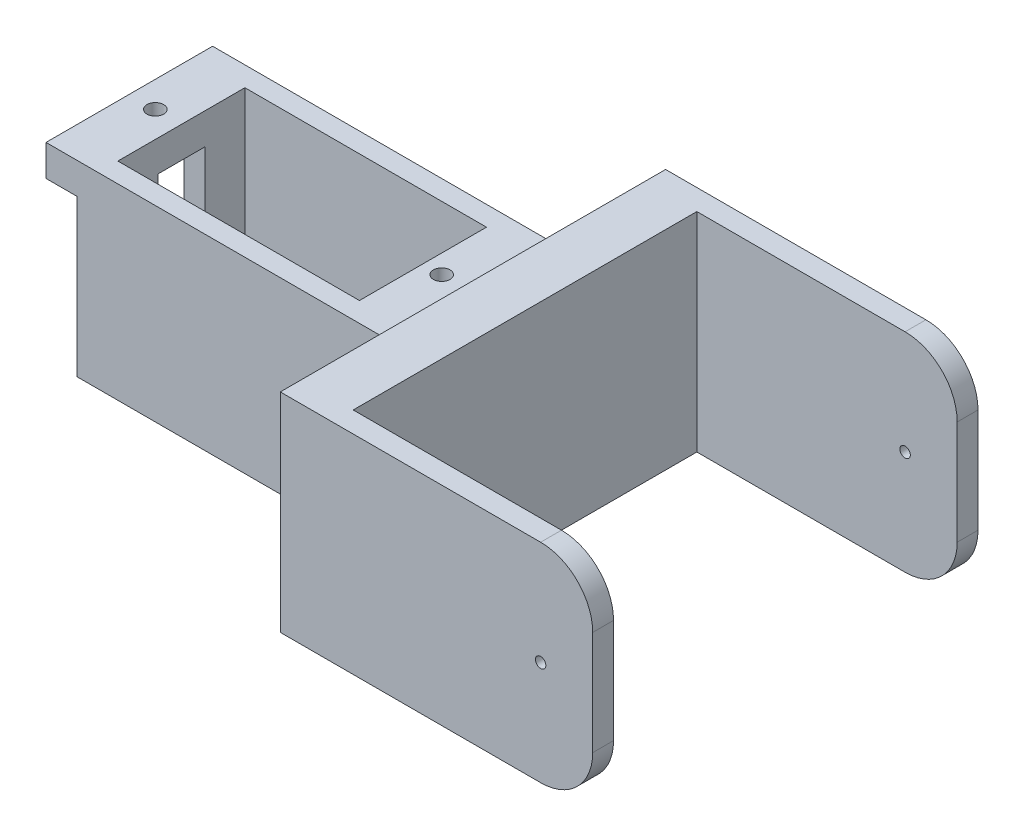
ISO-10303-21;
HEADER;
FILE_DESCRIPTION(('STEP AP214'),'2;1');
FILE_NAME('part.step','',(''),(''),'','','');
FILE_SCHEMA(('AUTOMOTIVE_DESIGN { 1 0 10303 214 1 1 1 1 }'));
ENDSEC;
DATA;
#1=APPLICATION_CONTEXT('core data for automotive mechanical design processes');
#2=APPLICATION_PROTOCOL_DEFINITION('international standard','automotive_design',2000,#1);
#3=PRODUCT_CONTEXT('',#1,'mechanical');
#4=PRODUCT('Part','Part','',(#3));
#5=PRODUCT_RELATED_PRODUCT_CATEGORY('part','',(#4));
#6=PRODUCT_DEFINITION_FORMATION('','',#4);
#7=PRODUCT_DEFINITION_CONTEXT('part definition',#1,'design');
#8=PRODUCT_DEFINITION('design','',#6,#7);
#9=PRODUCT_DEFINITION_SHAPE('','',#8);
#10=(LENGTH_UNIT() NAMED_UNIT(*) SI_UNIT(.MILLI.,.METRE.));
#11=(NAMED_UNIT(*) PLANE_ANGLE_UNIT() SI_UNIT($,.RADIAN.));
#12=(NAMED_UNIT(*) SI_UNIT($,.STERADIAN.) SOLID_ANGLE_UNIT());
#13=UNCERTAINTY_MEASURE_WITH_UNIT(LENGTH_MEASURE(1.E-05),#10,'distance_accuracy_value','');
#14=(GEOMETRIC_REPRESENTATION_CONTEXT(3) GLOBAL_UNCERTAINTY_ASSIGNED_CONTEXT((#13)) GLOBAL_UNIT_ASSIGNED_CONTEXT((#10,
#11,#12)) REPRESENTATION_CONTEXT('',''));
#15=CARTESIAN_POINT('',(0.,0.,0.));
#16=DIRECTION('',(0.,0.,1.));
#17=DIRECTION('',(1.,0.,0.));
#18=AXIS2_PLACEMENT_3D('',#15,#16,#17);
#19=CARTESIAN_POINT('',(20.,0.,0.));
#20=DIRECTION('',(1.,0.,0.));
#21=DIRECTION('',(0.,0.,-1.));
#22=AXIS2_PLACEMENT_3D('',#19,#20,#21);
#23=PLANE('',#22);
#24=DIRECTION('',(0.,0.,1.));
#25=VECTOR('',#24,1.);
#26=CARTESIAN_POINT('',(20.,19.,-18.5));
#27=LINE('',#26,#25);
#28=CARTESIAN_POINT('',(20.,19.,-16.5));
#29=VERTEX_POINT('',#28);
#30=CARTESIAN_POINT('',(20.,19.,16.5));
#31=VERTEX_POINT('',#30);
#32=EDGE_CURVE('E218',#29,#31,#27,.T.);
#33=ORIENTED_EDGE('',*,*,#32,.T.);
#34=DIRECTION('',(0.,1.,0.));
#35=VECTOR('',#34,1.);
#36=CARTESIAN_POINT('',(20.,19.,16.5));
#37=LINE('',#36,#35);
#38=CARTESIAN_POINT('',(20.,-1.,16.5));
#39=VERTEX_POINT('',#38);
#40=EDGE_CURVE('E227',#39,#31,#37,.T.);
#41=ORIENTED_EDGE('',*,*,#40,.F.);
#42=DIRECTION('',(0.,0.,-1.));
#43=VECTOR('',#42,1.);
#44=CARTESIAN_POINT('',(20.,-0.999999999999999,-18.5));
#45=LINE('',#44,#43);
#46=CARTESIAN_POINT('',(20.,-1.,-16.5));
#47=VERTEX_POINT('',#46);
#48=EDGE_CURVE('E240',#39,#47,#45,.T.);
#49=ORIENTED_EDGE('',*,*,#48,.T.);
#50=DIRECTION('',(0.,-1.,0.));
#51=VECTOR('',#50,1.);
#52=CARTESIAN_POINT('',(20.,19.,-16.5));
#53=LINE('',#52,#51);
#54=EDGE_CURVE('E238',#29,#47,#53,.T.);
#55=ORIENTED_EDGE('',*,*,#54,.F.);
#56=EDGE_LOOP('',(#33,#41,#49,#55));
#57=FACE_BOUND('',#56,.T.);
#58=ADVANCED_FACE('F36',(#57),#23,.T.);
#59=CARTESIAN_POINT('',(-15.,2.,8.));
#60=DIRECTION('',(1.,0.,0.));
#61=DIRECTION('',(0.,0.,-1.));
#62=AXIS2_PLACEMENT_3D('',#59,#60,#61);
#63=PLANE('',#62);
#64=DIRECTION('',(0.,-1.,0.));
#65=VECTOR('',#64,1.);
#66=CARTESIAN_POINT('',(-15.,2.,8.));
#67=LINE('',#66,#65);
#68=CARTESIAN_POINT('',(-15.,15.,8.));
#69=VERTEX_POINT('',#68);
#70=CARTESIAN_POINT('',(-15.,0.,8.));
#71=VERTEX_POINT('',#70);
#72=EDGE_CURVE('E381',#69,#71,#67,.T.);
#73=ORIENTED_EDGE('',*,*,#72,.F.);
#74=DIRECTION('',(0.,0.,-1.));
#75=VECTOR('',#74,1.);
#76=CARTESIAN_POINT('',(-15.,15.,8.));
#77=LINE('',#76,#75);
#78=CARTESIAN_POINT('',(-15.,15.,2.25));
#79=VERTEX_POINT('',#78);
#80=EDGE_CURVE('E299',#69,#79,#77,.T.);
#81=ORIENTED_EDGE('',*,*,#80,.T.);
#82=DIRECTION('',(0.,1.,0.));
#83=VECTOR('',#82,1.);
#84=CARTESIAN_POINT('',(-15.,18.,2.25));
#85=LINE('',#84,#83);
#86=CARTESIAN_POINT('',(-15.,5.,2.25));
#87=VERTEX_POINT('',#86);
#88=EDGE_CURVE('E309',#87,#79,#85,.T.);
#89=ORIENTED_EDGE('',*,*,#88,.F.);
#90=DIRECTION('',(0.,0.,1.));
#91=VECTOR('',#90,1.);
#92=CARTESIAN_POINT('',(-15.,5.,-2.25));
#93=LINE('',#92,#91);
#94=CARTESIAN_POINT('',(-15.,5.,-2.25));
#95=VERTEX_POINT('',#94);
#96=EDGE_CURVE('E323',#95,#87,#93,.T.);
#97=ORIENTED_EDGE('',*,*,#96,.F.);
#98=DIRECTION('',(0.,-1.,0.));
#99=VECTOR('',#98,1.);
#100=CARTESIAN_POINT('',(-15.,18.,-2.25));
#101=LINE('',#100,#99);
#102=CARTESIAN_POINT('',(-15.,15.,-2.25));
#103=VERTEX_POINT('',#102);
#104=EDGE_CURVE('E304',#103,#95,#101,.T.);
#105=ORIENTED_EDGE('',*,*,#104,.F.);
#106=CARTESIAN_POINT('',(-15.,15.,-8.));
#107=VERTEX_POINT('',#106);
#108=EDGE_CURVE('E293',#103,#107,#77,.T.);
#109=ORIENTED_EDGE('',*,*,#108,.T.);
#110=DIRECTION('',(0.,-1.,0.));
#111=VECTOR('',#110,1.);
#112=CARTESIAN_POINT('',(-15.,2.,-8.));
#113=LINE('',#112,#111);
#114=CARTESIAN_POINT('',(-15.,0.,-8.));
#115=VERTEX_POINT('',#114);
#116=EDGE_CURVE('E374',#107,#115,#113,.T.);
#117=ORIENTED_EDGE('',*,*,#116,.T.);
#118=DIRECTION('',(0.,0.,1.));
#119=VECTOR('',#118,1.);
#120=CARTESIAN_POINT('',(-15.,0.,8.));
#121=LINE('',#120,#119);
#122=EDGE_CURVE('E362',#115,#71,#121,.T.);
#123=ORIENTED_EDGE('',*,*,#122,.T.);
#124=EDGE_LOOP('',(#73,#81,#89,#97,#105,#109,#117,#123));
#125=FACE_BOUND('',#124,.T.);
#126=ADVANCED_FACE('F465',(#125),#63,.F.);
#127=CARTESIAN_POINT('',(15.,2.,8.));
#128=DIRECTION('',(0.,0.,-1.));
#129=DIRECTION('',(-1.,0.,0.));
#130=AXIS2_PLACEMENT_3D('',#127,#128,#129);
#131=PLANE('',#130);
#132=DIRECTION('',(0.,-1.,0.));
#133=VECTOR('',#132,1.);
#134=CARTESIAN_POINT('',(15.,2.,8.));
#135=LINE('',#134,#133);
#136=CARTESIAN_POINT('',(15.,18.,8.));
#137=VERTEX_POINT('',#136);
#138=CARTESIAN_POINT('',(15.,0.,8.));
#139=VERTEX_POINT('',#138);
#140=EDGE_CURVE('E378',#137,#139,#135,.T.);
#141=ORIENTED_EDGE('',*,*,#140,.F.);
#142=DIRECTION('',(1.,0.,0.));
#143=VECTOR('',#142,1.);
#144=CARTESIAN_POINT('',(-15.,18.,8.));
#145=LINE('',#144,#143);
#146=CARTESIAN_POINT('',(-18.,18.,8.));
#147=VERTEX_POINT('',#146);
#148=EDGE_CURVE('E356',#147,#137,#145,.T.);
#149=ORIENTED_EDGE('',*,*,#148,.F.);
#150=DIRECTION('',(0.,1.,0.));
#151=VECTOR('',#150,1.);
#152=CARTESIAN_POINT('',(-18.,15.,8.));
#153=LINE('',#152,#151);
#154=CARTESIAN_POINT('',(-18.,15.,8.));
#155=VERTEX_POINT('',#154);
#156=EDGE_CURVE('E290',#155,#147,#153,.T.);
#157=ORIENTED_EDGE('',*,*,#156,.F.);
#158=DIRECTION('',(1.,0.,0.));
#159=VECTOR('',#158,1.);
#160=CARTESIAN_POINT('',(-13.,15.,8.));
#161=LINE('',#160,#159);
#162=EDGE_CURVE('E284',#155,#69,#161,.T.);
#163=ORIENTED_EDGE('',*,*,#162,.T.);
#164=ORIENTED_EDGE('',*,*,#72,.T.);
#165=DIRECTION('',(1.,0.,0.));
#166=VECTOR('',#165,1.);
#167=CARTESIAN_POINT('',(15.,0.,8.));
#168=LINE('',#167,#166);
#169=EDGE_CURVE('E365',#71,#139,#168,.T.);
#170=ORIENTED_EDGE('',*,*,#169,.T.);
#171=EDGE_LOOP('',(#141,#149,#157,#163,#164,#170));
#172=FACE_BOUND('',#171,.T.);
#173=ADVANCED_FACE('F470',(#172),#131,.F.);
#174=CARTESIAN_POINT('',(15.,2.,-8.));
#175=DIRECTION('',(0.,0.,1.));
#176=DIRECTION('',(1.,0.,0.));
#177=AXIS2_PLACEMENT_3D('',#174,#175,#176);
#178=PLANE('',#177);
#179=DIRECTION('',(0.,1.,0.));
#180=VECTOR('',#179,1.);
#181=CARTESIAN_POINT('',(-18.,15.,-8.));
#182=LINE('',#181,#180);
#183=CARTESIAN_POINT('',(-18.,15.,-8.));
#184=VERTEX_POINT('',#183);
#185=CARTESIAN_POINT('',(-18.,18.,-8.));
#186=VERTEX_POINT('',#185);
#187=EDGE_CURVE('E287',#184,#186,#182,.T.);
#188=ORIENTED_EDGE('',*,*,#187,.T.);
#189=DIRECTION('',(-1.,0.,0.));
#190=VECTOR('',#189,1.);
#191=CARTESIAN_POINT('',(10.2,18.,-8.));
#192=LINE('',#191,#190);
#193=CARTESIAN_POINT('',(15.,18.,-8.));
#194=VERTEX_POINT('',#193);
#195=EDGE_CURVE('E360',#194,#186,#192,.T.);
#196=ORIENTED_EDGE('',*,*,#195,.F.);
#197=DIRECTION('',(0.,-1.,0.));
#198=VECTOR('',#197,1.);
#199=CARTESIAN_POINT('',(15.,2.,-8.));
#200=LINE('',#199,#198);
#201=CARTESIAN_POINT('',(15.,0.,-8.));
#202=VERTEX_POINT('',#201);
#203=EDGE_CURVE('E376',#194,#202,#200,.T.);
#204=ORIENTED_EDGE('',*,*,#203,.T.);
#205=DIRECTION('',(-1.,0.,0.));
#206=VECTOR('',#205,1.);
#207=CARTESIAN_POINT('',(15.,0.,-8.));
#208=LINE('',#207,#206);
#209=EDGE_CURVE('E371',#202,#115,#208,.T.);
#210=ORIENTED_EDGE('',*,*,#209,.T.);
#211=ORIENTED_EDGE('',*,*,#116,.F.);
#212=DIRECTION('',(-1.,0.,0.));
#213=VECTOR('',#212,1.);
#214=CARTESIAN_POINT('',(-13.,15.,-8.));
#215=LINE('',#214,#213);
#216=EDGE_CURVE('E279',#107,#184,#215,.T.);
#217=ORIENTED_EDGE('',*,*,#216,.T.);
#218=EDGE_LOOP('',(#188,#196,#204,#210,#211,#217));
#219=FACE_BOUND('',#218,.T.);
#220=ADVANCED_FACE('F556',(#219),#178,.F.);
#221=CARTESIAN_POINT('',(0.,0.,0.));
#222=DIRECTION('',(0.,1.,0.));
#223=DIRECTION('',(0.,0.,1.));
#224=AXIS2_PLACEMENT_3D('',#221,#222,#223);
#225=PLANE('',#224);
#226=CARTESIAN_POINT('',(-10.,0.,0.));
#227=DIRECTION('',(0.,-1.,0.));
#228=DIRECTION('',(0.,0.,-1.));
#229=AXIS2_PLACEMENT_3D('',#226,#227,#228);
#230=CIRCLE('',#229,0.800000000000001);
#231=CARTESIAN_POINT('',(-10.,0.,-0.800000000000001));
#232=VERTEX_POINT('',#231);
#233=EDGE_CURVE('E305',#232,#232,#230,.T.);
#234=ORIENTED_EDGE('',*,*,#233,.F.);
#235=EDGE_LOOP('',(#234));
#236=FACE_BOUND('',#235,.T.);
#237=ORIENTED_EDGE('',*,*,#122,.F.);
#238=ORIENTED_EDGE('',*,*,#209,.F.);
#239=DIRECTION('',(0.,0.,-1.));
#240=VECTOR('',#239,1.);
#241=CARTESIAN_POINT('',(15.,0.,8.));
#242=LINE('',#241,#240);
#243=EDGE_CURVE('E368',#139,#202,#242,.T.);
#244=ORIENTED_EDGE('',*,*,#243,.F.);
#245=ORIENTED_EDGE('',*,*,#169,.F.);
#246=EDGE_LOOP('',(#237,#238,#244,#245));
#247=FACE_BOUND('',#246,.T.);
#248=ADVANCED_FACE('F549',(#236,#247),#225,.F.);
#249=CARTESIAN_POINT('',(0.,18.,0.));
#250=DIRECTION('',(0.,1.,0.));
#251=DIRECTION('',(0.,0.,1.));
#252=AXIS2_PLACEMENT_3D('',#249,#250,#251);
#253=PLANE('',#252);
#254=CARTESIAN_POINT('',(-15.5009715513472,18.,0.));
#255=DIRECTION('',(0.,1.,0.));
#256=DIRECTION('',(0.,0.,1.));
#257=AXIS2_PLACEMENT_3D('',#254,#255,#256);
#258=CIRCLE('',#257,0.800000000000001);
#259=CARTESIAN_POINT('',(-15.5009715513472,18.,0.800000000000001));
#260=VERTEX_POINT('',#259);
#261=EDGE_CURVE('E265',#260,#260,#258,.T.);
#262=ORIENTED_EDGE('',*,*,#261,.F.);
#263=EDGE_LOOP('',(#262));
#264=FACE_BOUND('',#263,.T.);
#265=CARTESIAN_POINT('',(12.,18.,0.));
#266=DIRECTION('',(0.,1.,0.));
#267=DIRECTION('',(0.,0.,1.));
#268=AXIS2_PLACEMENT_3D('',#265,#266,#267);
#269=CIRCLE('',#268,0.800000000000001);
#270=CARTESIAN_POINT('',(12.,18.,0.800000000000001));
#271=VERTEX_POINT('',#270);
#272=EDGE_CURVE('E273',#271,#271,#269,.T.);
#273=ORIENTED_EDGE('',*,*,#272,.F.);
#274=EDGE_LOOP('',(#273));
#275=FACE_BOUND('',#274,.T.);
#276=DIRECTION('',(-1.,0.,0.));
#277=VECTOR('',#276,1.);
#278=CARTESIAN_POINT('',(-13.,18.,-6.1));
#279=LINE('',#278,#277);
#280=CARTESIAN_POINT('',(10.2,18.,-6.1));
#281=VERTEX_POINT('',#280);
#282=CARTESIAN_POINT('',(-13.,18.,-6.1));
#283=VERTEX_POINT('',#282);
#284=EDGE_CURVE('E331',#281,#283,#279,.T.);
#285=ORIENTED_EDGE('',*,*,#284,.F.);
#286=DIRECTION('',(0.,0.,-1.));
#287=VECTOR('',#286,1.);
#288=CARTESIAN_POINT('',(10.2,18.,-6.1));
#289=LINE('',#288,#287);
#290=CARTESIAN_POINT('',(10.2,18.,6.1));
#291=VERTEX_POINT('',#290);
#292=EDGE_CURVE('E329',#291,#281,#289,.T.);
#293=ORIENTED_EDGE('',*,*,#292,.F.);
#294=DIRECTION('',(1.,0.,0.));
#295=VECTOR('',#294,1.);
#296=CARTESIAN_POINT('',(-13.,18.,6.1));
#297=LINE('',#296,#295);
#298=CARTESIAN_POINT('',(-13.,18.,6.1));
#299=VERTEX_POINT('',#298);
#300=EDGE_CURVE('E336',#299,#291,#297,.T.);
#301=ORIENTED_EDGE('',*,*,#300,.F.);
#302=DIRECTION('',(0.,0.,1.));
#303=VECTOR('',#302,1.);
#304=CARTESIAN_POINT('',(-13.,18.,-6.1));
#305=LINE('',#304,#303);
#306=EDGE_CURVE('E334',#283,#299,#305,.T.);
#307=ORIENTED_EDGE('',*,*,#306,.F.);
#308=EDGE_LOOP('',(#285,#293,#301,#307));
#309=FACE_BOUND('',#308,.T.);
#310=ORIENTED_EDGE('',*,*,#195,.T.);
#311=DIRECTION('',(0.,0.,1.));
#312=VECTOR('',#311,1.);
#313=CARTESIAN_POINT('',(-18.,18.,-8.));
#314=LINE('',#313,#312);
#315=EDGE_CURVE('E272',#186,#147,#314,.T.);
#316=ORIENTED_EDGE('',*,*,#315,.T.);
#317=ORIENTED_EDGE('',*,*,#148,.T.);
#318=DIRECTION('',(0.,0.,-1.));
#319=VECTOR('',#318,1.);
#320=CARTESIAN_POINT('',(15.,18.,-8.));
#321=LINE('',#320,#319);
#322=EDGE_CURVE('E358',#137,#194,#321,.T.);
#323=ORIENTED_EDGE('',*,*,#322,.T.);
#324=EDGE_LOOP('',(#310,#316,#317,#323));
#325=FACE_BOUND('',#324,.T.);
#326=ADVANCED_FACE('F545',(#264,#275,#309,#325),#253,.T.);
#327=CARTESIAN_POINT('',(10.2,18.,-6.1));
#328=DIRECTION('',(-1.,0.,0.));
#329=DIRECTION('',(0.,0.,1.));
#330=AXIS2_PLACEMENT_3D('',#327,#328,#329);
#331=PLANE('',#330);
#332=DIRECTION('',(0.,-1.,0.));
#333=VECTOR('',#332,1.);
#334=CARTESIAN_POINT('',(10.2,18.,-6.1));
#335=LINE('',#334,#333);
#336=CARTESIAN_POINT('',(10.2,2.,-6.1));
#337=VERTEX_POINT('',#336);
#338=EDGE_CURVE('E354',#281,#337,#335,.T.);
#339=ORIENTED_EDGE('',*,*,#338,.T.);
#340=DIRECTION('',(0.,0.,-1.));
#341=VECTOR('',#340,1.);
#342=CARTESIAN_POINT('',(10.2,2.,-6.1));
#343=LINE('',#342,#341);
#344=CARTESIAN_POINT('',(10.2,2.,6.1));
#345=VERTEX_POINT('',#344);
#346=EDGE_CURVE('E328',#345,#337,#343,.T.);
#347=ORIENTED_EDGE('',*,*,#346,.F.);
#348=DIRECTION('',(0.,-1.,0.));
#349=VECTOR('',#348,1.);
#350=CARTESIAN_POINT('',(10.2,18.,6.1));
#351=LINE('',#350,#349);
#352=EDGE_CURVE('E338',#291,#345,#351,.T.);
#353=ORIENTED_EDGE('',*,*,#352,.F.);
#354=ORIENTED_EDGE('',*,*,#292,.T.);
#355=EDGE_LOOP('',(#339,#347,#353,#354));
#356=FACE_BOUND('',#355,.T.);
#357=ADVANCED_FACE('F541',(#356),#331,.T.);
#358=CARTESIAN_POINT('',(-13.,18.,-6.1));
#359=DIRECTION('',(0.,0.,1.));
#360=DIRECTION('',(1.,0.,0.));
#361=AXIS2_PLACEMENT_3D('',#358,#359,#360);
#362=PLANE('',#361);
#363=DIRECTION('',(-1.,0.,0.));
#364=VECTOR('',#363,1.);
#365=CARTESIAN_POINT('',(-13.,2.,-6.1));
#366=LINE('',#365,#364);
#367=CARTESIAN_POINT('',(-13.,2.,-6.1));
#368=VERTEX_POINT('',#367);
#369=EDGE_CURVE('E341',#337,#368,#366,.T.);
#370=ORIENTED_EDGE('',*,*,#369,.F.);
#371=ORIENTED_EDGE('',*,*,#338,.F.);
#372=ORIENTED_EDGE('',*,*,#284,.T.);
#373=DIRECTION('',(0.,-1.,0.));
#374=VECTOR('',#373,1.);
#375=CARTESIAN_POINT('',(-13.,18.,-6.1));
#376=LINE('',#375,#374);
#377=EDGE_CURVE('E352',#283,#368,#376,.T.);
#378=ORIENTED_EDGE('',*,*,#377,.T.);
#379=EDGE_LOOP('',(#370,#371,#372,#378));
#380=FACE_BOUND('',#379,.T.);
#381=ADVANCED_FACE('F537',(#380),#362,.T.);
#382=CARTESIAN_POINT('',(-13.,18.,-6.1));
#383=DIRECTION('',(1.,0.,0.));
#384=DIRECTION('',(0.,0.,-1.));
#385=AXIS2_PLACEMENT_3D('',#382,#383,#384);
#386=PLANE('',#385);
#387=DIRECTION('',(0.,-1.,0.));
#388=VECTOR('',#387,1.);
#389=CARTESIAN_POINT('',(-13.,18.,2.25));
#390=LINE('',#389,#388);
#391=CARTESIAN_POINT('',(-13.,15.,2.25));
#392=VERTEX_POINT('',#391);
#393=CARTESIAN_POINT('',(-13.,5.,2.25));
#394=VERTEX_POINT('',#393);
#395=EDGE_CURVE('E312',#392,#394,#390,.T.);
#396=ORIENTED_EDGE('',*,*,#395,.F.);
#397=DIRECTION('',(0.,0.,-1.));
#398=VECTOR('',#397,1.);
#399=CARTESIAN_POINT('',(-13.,15.,-8.));
#400=LINE('',#399,#398);
#401=CARTESIAN_POINT('',(-13.,15.,-2.25));
#402=VERTEX_POINT('',#401);
#403=EDGE_CURVE('E276',#392,#402,#400,.T.);
#404=ORIENTED_EDGE('',*,*,#403,.T.);
#405=DIRECTION('',(0.,1.,0.));
#406=VECTOR('',#405,1.);
#407=CARTESIAN_POINT('',(-13.,18.,-2.25));
#408=LINE('',#407,#406);
#409=CARTESIAN_POINT('',(-13.,5.,-2.25));
#410=VERTEX_POINT('',#409);
#411=EDGE_CURVE('E317',#410,#402,#408,.T.);
#412=ORIENTED_EDGE('',*,*,#411,.F.);
#413=DIRECTION('',(0.,0.,-1.));
#414=VECTOR('',#413,1.);
#415=CARTESIAN_POINT('',(-13.,5.,-2.25));
#416=LINE('',#415,#414);
#417=EDGE_CURVE('E314',#394,#410,#416,.T.);
#418=ORIENTED_EDGE('',*,*,#417,.F.);
#419=EDGE_LOOP('',(#396,#404,#412,#418));
#420=FACE_BOUND('',#419,.T.);
#421=DIRECTION('',(0.,-1.,0.));
#422=VECTOR('',#421,1.);
#423=CARTESIAN_POINT('',(-13.,18.,6.1));
#424=LINE('',#423,#422);
#425=CARTESIAN_POINT('',(-13.,2.,6.1));
#426=VERTEX_POINT('',#425);
#427=EDGE_CURVE('E350',#299,#426,#424,.T.);
#428=ORIENTED_EDGE('',*,*,#427,.T.);
#429=DIRECTION('',(0.,0.,1.));
#430=VECTOR('',#429,1.);
#431=CARTESIAN_POINT('',(-13.,2.,-6.1));
#432=LINE('',#431,#430);
#433=EDGE_CURVE('E344',#368,#426,#432,.T.);
#434=ORIENTED_EDGE('',*,*,#433,.F.);
#435=ORIENTED_EDGE('',*,*,#377,.F.);
#436=ORIENTED_EDGE('',*,*,#306,.T.);
#437=EDGE_LOOP('',(#428,#434,#435,#436));
#438=FACE_BOUND('',#437,.T.);
#439=ADVANCED_FACE('F533',(#420,#438),#386,.T.);
#440=CARTESIAN_POINT('',(-13.,18.,6.1));
#441=DIRECTION('',(0.,0.,-1.));
#442=DIRECTION('',(-1.,0.,0.));
#443=AXIS2_PLACEMENT_3D('',#440,#441,#442);
#444=PLANE('',#443);
#445=DIRECTION('',(1.,0.,0.));
#446=VECTOR('',#445,1.);
#447=CARTESIAN_POINT('',(-13.,2.,6.1));
#448=LINE('',#447,#446);
#449=EDGE_CURVE('E332',#426,#345,#448,.T.);
#450=ORIENTED_EDGE('',*,*,#449,.F.);
#451=ORIENTED_EDGE('',*,*,#427,.F.);
#452=ORIENTED_EDGE('',*,*,#300,.T.);
#453=ORIENTED_EDGE('',*,*,#352,.T.);
#454=EDGE_LOOP('',(#450,#451,#452,#453));
#455=FACE_BOUND('',#454,.T.);
#456=ADVANCED_FACE('F530',(#455),#444,.T.);
#457=CARTESIAN_POINT('',(0.,2.,0.));
#458=DIRECTION('',(0.,1.,0.));
#459=DIRECTION('',(0.,0.,1.));
#460=AXIS2_PLACEMENT_3D('',#457,#458,#459);
#461=PLANE('',#460);
#462=CARTESIAN_POINT('',(-10.,2.,0.));
#463=DIRECTION('',(0.,-1.,0.));
#464=DIRECTION('',(0.,0.,-1.));
#465=AXIS2_PLACEMENT_3D('',#462,#463,#464);
#466=CIRCLE('',#465,0.800000000000001);
#467=CARTESIAN_POINT('',(-10.,2.,-0.800000000000001));
#468=VERTEX_POINT('',#467);
#469=EDGE_CURVE('E301',#468,#468,#466,.T.);
#470=ORIENTED_EDGE('',*,*,#469,.T.);
#471=EDGE_LOOP('',(#470));
#472=FACE_BOUND('',#471,.T.);
#473=ORIENTED_EDGE('',*,*,#346,.T.);
#474=ORIENTED_EDGE('',*,*,#369,.T.);
#475=ORIENTED_EDGE('',*,*,#433,.T.);
#476=ORIENTED_EDGE('',*,*,#449,.T.);
#477=EDGE_LOOP('',(#473,#474,#475,#476));
#478=FACE_BOUND('',#477,.T.);
#479=ADVANCED_FACE('F528',(#472,#478),#461,.T.);
#480=CARTESIAN_POINT('',(-15.001,18.,2.25));
#481=DIRECTION('',(0.,0.,1.));
#482=DIRECTION('',(0.,-1.,0.));
#483=AXIS2_PLACEMENT_3D('',#480,#481,#482);
#484=PLANE('',#483);
#485=ORIENTED_EDGE('',*,*,#88,.T.);
#486=DIRECTION('',(1.,0.,0.));
#487=VECTOR('',#486,1.);
#488=CARTESIAN_POINT('',(-15.001,15.,2.25));
#489=LINE('',#488,#487);
#490=EDGE_CURVE('E298',#79,#392,#489,.T.);
#491=ORIENTED_EDGE('',*,*,#490,.T.);
#492=ORIENTED_EDGE('',*,*,#395,.T.);
#493=DIRECTION('',(1.,0.,0.));
#494=VECTOR('',#493,1.);
#495=CARTESIAN_POINT('',(-15.001,5.,2.25));
#496=LINE('',#495,#494);
#497=EDGE_CURVE('E320',#87,#394,#496,.T.);
#498=ORIENTED_EDGE('',*,*,#497,.F.);
#499=EDGE_LOOP('',(#485,#491,#492,#498));
#500=FACE_BOUND('',#499,.T.);
#501=ADVANCED_FACE('F521',(#500),#484,.F.);
#502=CARTESIAN_POINT('',(-15.001,18.,-2.25));
#503=DIRECTION('',(0.,0.,-1.));
#504=DIRECTION('',(0.,1.,0.));
#505=AXIS2_PLACEMENT_3D('',#502,#503,#504);
#506=PLANE('',#505);
#507=ORIENTED_EDGE('',*,*,#411,.T.);
#508=DIRECTION('',(-1.,0.,0.));
#509=VECTOR('',#508,1.);
#510=CARTESIAN_POINT('',(-15.001,15.,-2.25));
#511=LINE('',#510,#509);
#512=EDGE_CURVE('E383',#402,#103,#511,.T.);
#513=ORIENTED_EDGE('',*,*,#512,.T.);
#514=ORIENTED_EDGE('',*,*,#104,.T.);
#515=DIRECTION('',(1.,0.,0.));
#516=VECTOR('',#515,1.);
#517=CARTESIAN_POINT('',(-15.001,5.,-2.25));
#518=LINE('',#517,#516);
#519=EDGE_CURVE('E321',#95,#410,#518,.T.);
#520=ORIENTED_EDGE('',*,*,#519,.T.);
#521=EDGE_LOOP('',(#507,#513,#514,#520));
#522=FACE_BOUND('',#521,.T.);
#523=ADVANCED_FACE('F518',(#522),#506,.F.);
#524=CARTESIAN_POINT('',(-15.001,5.,-2.25));
#525=DIRECTION('',(0.,-1.,0.));
#526=DIRECTION('',(0.,0.,-1.));
#527=AXIS2_PLACEMENT_3D('',#524,#525,#526);
#528=PLANE('',#527);
#529=ORIENTED_EDGE('',*,*,#96,.T.);
#530=ORIENTED_EDGE('',*,*,#497,.T.);
#531=ORIENTED_EDGE('',*,*,#417,.T.);
#532=ORIENTED_EDGE('',*,*,#519,.F.);
#533=EDGE_LOOP('',(#529,#530,#531,#532));
#534=FACE_BOUND('',#533,.T.);
#535=ADVANCED_FACE('F516',(#534),#528,.F.);
#536=CARTESIAN_POINT('',(-10.,2.,0.));
#537=DIRECTION('',(0.,-1.,0.));
#538=DIRECTION('',(0.,0.,-1.));
#539=AXIS2_PLACEMENT_3D('',#536,#537,#538);
#540=CYLINDRICAL_SURFACE('',#539,0.800000000000001);
#541=ORIENTED_EDGE('',*,*,#469,.F.);
#542=EDGE_LOOP('',(#541));
#543=FACE_BOUND('',#542,.T.);
#544=ORIENTED_EDGE('',*,*,#233,.T.);
#545=EDGE_LOOP('',(#544));
#546=FACE_BOUND('',#545,.T.);
#547=ADVANCED_FACE('F509',(#543,#546),#540,.F.);
#548=CARTESIAN_POINT('',(0.,15.,0.));
#549=DIRECTION('',(0.,-1.,0.));
#550=DIRECTION('',(0.,0.,-1.));
#551=AXIS2_PLACEMENT_3D('',#548,#549,#550);
#552=PLANE('',#551);
#553=CARTESIAN_POINT('',(-15.5009715513472,15.,0.));
#554=DIRECTION('',(0.,-1.,0.));
#555=DIRECTION('',(0.,0.,-1.));
#556=AXIS2_PLACEMENT_3D('',#553,#554,#555);
#557=CIRCLE('',#556,0.800000000000001);
#558=CARTESIAN_POINT('',(-15.5009715513472,15.,-0.800000000000001));
#559=VERTEX_POINT('',#558);
#560=EDGE_CURVE('E268',#559,#559,#557,.T.);
#561=ORIENTED_EDGE('',*,*,#560,.F.);
#562=EDGE_LOOP('',(#561));
#563=FACE_BOUND('',#562,.T.);
#564=ORIENTED_EDGE('',*,*,#80,.F.);
#565=ORIENTED_EDGE('',*,*,#162,.F.);
#566=DIRECTION('',(0.,0.,1.));
#567=VECTOR('',#566,1.);
#568=CARTESIAN_POINT('',(-18.,15.,-8.));
#569=LINE('',#568,#567);
#570=EDGE_CURVE('E281',#184,#155,#569,.T.);
#571=ORIENTED_EDGE('',*,*,#570,.F.);
#572=ORIENTED_EDGE('',*,*,#216,.F.);
#573=ORIENTED_EDGE('',*,*,#108,.F.);
#574=ORIENTED_EDGE('',*,*,#512,.F.);
#575=ORIENTED_EDGE('',*,*,#403,.F.);
#576=ORIENTED_EDGE('',*,*,#490,.F.);
#577=EDGE_LOOP('',(#564,#565,#571,#572,#573,#574,#575,#576));
#578=FACE_BOUND('',#577,.T.);
#579=ADVANCED_FACE('F506',(#563,#578),#552,.T.);
#580=CARTESIAN_POINT('',(-18.,15.,-8.));
#581=DIRECTION('',(-1.,0.,0.));
#582=DIRECTION('',(0.,0.,1.));
#583=AXIS2_PLACEMENT_3D('',#580,#581,#582);
#584=PLANE('',#583);
#585=ORIENTED_EDGE('',*,*,#315,.F.);
#586=ORIENTED_EDGE('',*,*,#187,.F.);
#587=ORIENTED_EDGE('',*,*,#570,.T.);
#588=ORIENTED_EDGE('',*,*,#156,.T.);
#589=EDGE_LOOP('',(#585,#586,#587,#588));
#590=FACE_BOUND('',#589,.T.);
#591=ADVANCED_FACE('F504',(#590),#584,.T.);
#592=CARTESIAN_POINT('',(12.,13.,0.));
#593=DIRECTION('',(0.,1.,0.));
#594=DIRECTION('',(0.,0.,1.));
#595=AXIS2_PLACEMENT_3D('',#592,#593,#594);
#596=CYLINDRICAL_SURFACE('',#595,0.800000000000001);
#597=CARTESIAN_POINT('',(12.,13.,0.));
#598=DIRECTION('',(0.,1.,0.));
#599=DIRECTION('',(0.,0.,1.));
#600=AXIS2_PLACEMENT_3D('',#597,#598,#599);
#601=CIRCLE('',#600,0.800000000000001);
#602=CARTESIAN_POINT('',(12.,13.,0.800000000000001));
#603=VERTEX_POINT('',#602);
#604=EDGE_CURVE('E269',#603,#603,#601,.T.);
#605=ORIENTED_EDGE('',*,*,#604,.F.);
#606=EDGE_LOOP('',(#605));
#607=FACE_BOUND('',#606,.T.);
#608=ORIENTED_EDGE('',*,*,#272,.T.);
#609=EDGE_LOOP('',(#608));
#610=FACE_BOUND('',#609,.T.);
#611=ADVANCED_FACE('F500',(#607,#610),#596,.F.);
#612=CARTESIAN_POINT('',(12.,13.,0.));
#613=DIRECTION('',(0.,1.,0.));
#614=DIRECTION('',(0.,0.,1.));
#615=AXIS2_PLACEMENT_3D('',#612,#613,#614);
#616=PLANE('',#615);
#617=ORIENTED_EDGE('',*,*,#604,.T.);
#618=EDGE_LOOP('',(#617));
#619=FACE_BOUND('',#618,.T.);
#620=ADVANCED_FACE('F496',(#619),#616,.T.);
#621=CARTESIAN_POINT('',(-15.5009715513472,13.,0.));
#622=DIRECTION('',(0.,1.,0.));
#623=DIRECTION('',(0.,0.,1.));
#624=AXIS2_PLACEMENT_3D('',#621,#622,#623);
#625=CYLINDRICAL_SURFACE('',#624,0.800000000000001);
#626=ORIENTED_EDGE('',*,*,#560,.T.);
#627=EDGE_LOOP('',(#626));
#628=FACE_BOUND('',#627,.T.);
#629=ORIENTED_EDGE('',*,*,#261,.T.);
#630=EDGE_LOOP('',(#629));
#631=FACE_BOUND('',#630,.T.);
#632=ADVANCED_FACE('F480',(#628,#631),#625,.F.);
#633=CARTESIAN_POINT('',(15.,0.,0.));
#634=DIRECTION('',(1.,0.,0.));
#635=DIRECTION('',(0.,0.,-1.));
#636=AXIS2_PLACEMENT_3D('',#633,#634,#635);
#637=PLANE('',#636);
#638=DIRECTION('',(0.,-1.,0.));
#639=VECTOR('',#638,1.);
#640=CARTESIAN_POINT('',(15.,-1.,18.5));
#641=LINE('',#640,#639);
#642=CARTESIAN_POINT('',(15.,19.,18.5));
#643=VERTEX_POINT('',#642);
#644=CARTESIAN_POINT('',(15.,-1.,18.5));
#645=VERTEX_POINT('',#644);
#646=EDGE_CURVE('E248',#643,#645,#641,.T.);
#647=ORIENTED_EDGE('',*,*,#646,.F.);
#648=DIRECTION('',(0.,0.,1.));
#649=VECTOR('',#648,1.);
#650=CARTESIAN_POINT('',(15.,19.,-18.5));
#651=LINE('',#650,#649);
#652=CARTESIAN_POINT('',(15.,19.,-18.5));
#653=VERTEX_POINT('',#652);
#654=EDGE_CURVE('E244',#653,#643,#651,.T.);
#655=ORIENTED_EDGE('',*,*,#654,.F.);
#656=DIRECTION('',(0.,1.,0.));
#657=VECTOR('',#656,1.);
#658=CARTESIAN_POINT('',(15.,-0.999999999999999,-18.5));
#659=LINE('',#658,#657);
#660=CARTESIAN_POINT('',(15.,-0.999999999999999,-18.5));
#661=VERTEX_POINT('',#660);
#662=EDGE_CURVE('E255',#661,#653,#659,.T.);
#663=ORIENTED_EDGE('',*,*,#662,.F.);
#664=DIRECTION('',(0.,0.,-1.));
#665=VECTOR('',#664,1.);
#666=CARTESIAN_POINT('',(15.,-0.999999999999999,-18.5));
#667=LINE('',#666,#665);
#668=EDGE_CURVE('E251',#645,#661,#667,.T.);
#669=ORIENTED_EDGE('',*,*,#668,.F.);
#670=EDGE_LOOP('',(#647,#655,#663,#669));
#671=FACE_BOUND('',#670,.T.);
#672=ORIENTED_EDGE('',*,*,#140,.T.);
#673=ORIENTED_EDGE('',*,*,#243,.T.);
#674=ORIENTED_EDGE('',*,*,#203,.F.);
#675=ORIENTED_EDGE('',*,*,#322,.F.);
#676=EDGE_LOOP('',(#672,#673,#674,#675));
#677=FACE_BOUND('',#676,.T.);
#678=ADVANCED_FACE('F476',(#671,#677),#637,.F.);
#679=CARTESIAN_POINT('',(20.,-1.,18.5));
#680=DIRECTION('',(0.,0.,-1.));
#681=DIRECTION('',(-1.,0.,0.));
#682=AXIS2_PLACEMENT_3D('',#679,#680,#681);
#683=PLANE('',#682);
#684=CARTESIAN_POINT('',(40.,9.,18.5));
#685=DIRECTION('',(0.,0.,-1.));
#686=DIRECTION('',(-1.,0.,0.));
#687=AXIS2_PLACEMENT_3D('',#684,#685,#686);
#688=CIRCLE('',#687,0.499999999999999);
#689=CARTESIAN_POINT('',(39.5,9.,18.5));
#690=VERTEX_POINT('',#689);
#691=EDGE_CURVE('E444',#690,#690,#688,.T.);
#692=ORIENTED_EDGE('',*,*,#691,.T.);
#693=EDGE_LOOP('',(#692));
#694=FACE_BOUND('',#693,.T.);
#695=DIRECTION('',(0.,-1.,0.));
#696=VECTOR('',#695,1.);
#697=CARTESIAN_POINT('',(45.,19.,18.5));
#698=LINE('',#697,#696);
#699=CARTESIAN_POINT('',(45.,14.,18.5));
#700=VERTEX_POINT('',#699);
#701=CARTESIAN_POINT('',(45.,4.,18.5));
#702=VERTEX_POINT('',#701);
#703=EDGE_CURVE('E233',#700,#702,#698,.T.);
#704=ORIENTED_EDGE('',*,*,#703,.F.);
#705=CARTESIAN_POINT('',(40.,14.,18.5));
#706=DIRECTION('',(0.,0.,-1.));
#707=DIRECTION('',(-1.,0.,0.));
#708=AXIS2_PLACEMENT_3D('',#705,#706,#707);
#709=CIRCLE('',#708,5.);
#710=CARTESIAN_POINT('',(40.,19.,18.5));
#711=VERTEX_POINT('',#710);
#712=EDGE_CURVE('E396',#700,#711,#709,.F.);
#713=ORIENTED_EDGE('',*,*,#712,.T.);
#714=DIRECTION('',(-1.,0.,0.));
#715=VECTOR('',#714,1.);
#716=CARTESIAN_POINT('',(20.,19.,18.5));
#717=LINE('',#716,#715);
#718=EDGE_CURVE('E239',#711,#643,#717,.T.);
#719=ORIENTED_EDGE('',*,*,#718,.T.);
#720=ORIENTED_EDGE('',*,*,#646,.T.);
#721=DIRECTION('',(-1.,0.,0.));
#722=VECTOR('',#721,1.);
#723=CARTESIAN_POINT('',(20.,-1.,18.5));
#724=LINE('',#723,#722);
#725=CARTESIAN_POINT('',(40.,-1.,18.5));
#726=VERTEX_POINT('',#725);
#727=EDGE_CURVE('E263',#726,#645,#724,.T.);
#728=ORIENTED_EDGE('',*,*,#727,.F.);
#729=CARTESIAN_POINT('',(40.,4.,18.5));
#730=DIRECTION('',(0.,0.,-1.));
#731=DIRECTION('',(-1.,0.,0.));
#732=AXIS2_PLACEMENT_3D('',#729,#730,#731);
#733=CIRCLE('',#732,5.);
#734=EDGE_CURVE('E394',#726,#702,#733,.F.);
#735=ORIENTED_EDGE('',*,*,#734,.T.);
#736=EDGE_LOOP('',(#704,#713,#719,#720,#728,#735));
#737=FACE_BOUND('',#736,.T.);
#738=ADVANCED_FACE('F479',(#694,#737),#683,.F.);
#739=CARTESIAN_POINT('',(20.,-0.999999999999999,-18.5));
#740=DIRECTION('',(0.,1.,0.));
#741=DIRECTION('',(0.,0.,1.));
#742=AXIS2_PLACEMENT_3D('',#739,#740,#741);
#743=PLANE('',#742);
#744=DIRECTION('',(-1.,0.,0.));
#745=VECTOR('',#744,1.);
#746=CARTESIAN_POINT('',(45.,-1.,16.5));
#747=LINE('',#746,#745);
#748=CARTESIAN_POINT('',(40.,-1.,16.5));
#749=VERTEX_POINT('',#748);
#750=EDGE_CURVE('E223',#749,#39,#747,.T.);
#751=ORIENTED_EDGE('',*,*,#750,.F.);
#752=DIRECTION('',(0.,0.,-1.));
#753=VECTOR('',#752,1.);
#754=CARTESIAN_POINT('',(40.,-0.999999999999999,-18.5));
#755=LINE('',#754,#753);
#756=EDGE_CURVE('E407',#749,#726,#755,.F.);
#757=ORIENTED_EDGE('',*,*,#756,.T.);
#758=ORIENTED_EDGE('',*,*,#727,.T.);
#759=ORIENTED_EDGE('',*,*,#668,.T.);
#760=DIRECTION('',(-1.,0.,0.));
#761=VECTOR('',#760,1.);
#762=CARTESIAN_POINT('',(20.,-0.999999999999999,-18.5));
#763=LINE('',#762,#761);
#764=CARTESIAN_POINT('',(40.,-0.999999999999999,-18.5));
#765=VERTEX_POINT('',#764);
#766=EDGE_CURVE('E261',#765,#661,#763,.T.);
#767=ORIENTED_EDGE('',*,*,#766,.F.);
#768=DIRECTION('',(0.,0.,-1.));
#769=VECTOR('',#768,1.);
#770=CARTESIAN_POINT('',(40.,-0.999999999999999,-16.5));
#771=LINE('',#770,#769);
#772=CARTESIAN_POINT('',(40.,-1.,-16.5));
#773=VERTEX_POINT('',#772);
#774=EDGE_CURVE('E405',#765,#773,#771,.F.);
#775=ORIENTED_EDGE('',*,*,#774,.T.);
#776=DIRECTION('',(-1.,0.,0.));
#777=VECTOR('',#776,1.);
#778=CARTESIAN_POINT('',(45.,-1.,-16.5));
#779=LINE('',#778,#777);
#780=EDGE_CURVE('E425',#773,#47,#779,.T.);
#781=ORIENTED_EDGE('',*,*,#780,.T.);
#782=ORIENTED_EDGE('',*,*,#48,.F.);
#783=EDGE_LOOP('',(#751,#757,#758,#759,#767,#775,#781,#782));
#784=FACE_BOUND('',#783,.T.);
#785=ADVANCED_FACE('F487',(#784),#743,.F.);
#786=CARTESIAN_POINT('',(20.,-0.999999999999999,-18.5));
#787=DIRECTION('',(0.,0.,1.));
#788=DIRECTION('',(1.,0.,0.));
#789=AXIS2_PLACEMENT_3D('',#786,#787,#788);
#790=PLANE('',#789);
#791=CARTESIAN_POINT('',(40.,9.,-18.5));
#792=DIRECTION('',(0.,0.,1.));
#793=DIRECTION('',(1.,0.,0.));
#794=AXIS2_PLACEMENT_3D('',#791,#792,#793);
#795=CIRCLE('',#794,0.499999999999999);
#796=CARTESIAN_POINT('',(40.5,9.,-18.5));
#797=VERTEX_POINT('',#796);
#798=EDGE_CURVE('E234',#797,#797,#795,.T.);
#799=ORIENTED_EDGE('',*,*,#798,.T.);
#800=EDGE_LOOP('',(#799));
#801=FACE_BOUND('',#800,.T.);
#802=DIRECTION('',(0.,1.,0.));
#803=VECTOR('',#802,1.);
#804=CARTESIAN_POINT('',(45.,19.,-18.5));
#805=LINE('',#804,#803);
#806=CARTESIAN_POINT('',(45.,4.,-18.5));
#807=VERTEX_POINT('',#806);
#808=CARTESIAN_POINT('',(45.,14.,-18.5));
#809=VERTEX_POINT('',#808);
#810=EDGE_CURVE('E428',#807,#809,#805,.T.);
#811=ORIENTED_EDGE('',*,*,#810,.F.);
#812=CARTESIAN_POINT('',(40.,4.,-18.5));
#813=DIRECTION('',(0.,0.,1.));
#814=DIRECTION('',(1.,0.,0.));
#815=AXIS2_PLACEMENT_3D('',#812,#813,#814);
#816=CIRCLE('',#815,5.);
#817=EDGE_CURVE('E60',#807,#765,#816,.F.);
#818=ORIENTED_EDGE('',*,*,#817,.T.);
#819=ORIENTED_EDGE('',*,*,#766,.T.);
#820=ORIENTED_EDGE('',*,*,#662,.T.);
#821=DIRECTION('',(-1.,0.,0.));
#822=VECTOR('',#821,1.);
#823=CARTESIAN_POINT('',(20.,19.,-18.5));
#824=LINE('',#823,#822);
#825=CARTESIAN_POINT('',(40.,19.,-18.5));
#826=VERTEX_POINT('',#825);
#827=EDGE_CURVE('E242',#826,#653,#824,.T.);
#828=ORIENTED_EDGE('',*,*,#827,.F.);
#829=CARTESIAN_POINT('',(40.,14.,-18.5));
#830=DIRECTION('',(0.,0.,1.));
#831=DIRECTION('',(1.,0.,0.));
#832=AXIS2_PLACEMENT_3D('',#829,#830,#831);
#833=CIRCLE('',#832,5.);
#834=EDGE_CURVE('E52',#826,#809,#833,.F.);
#835=ORIENTED_EDGE('',*,*,#834,.T.);
#836=EDGE_LOOP('',(#811,#818,#819,#820,#828,#835));
#837=FACE_BOUND('',#836,.T.);
#838=ADVANCED_FACE('F484',(#801,#837),#790,.F.);
#839=CARTESIAN_POINT('',(20.,19.,-18.5));
#840=DIRECTION('',(0.,-1.,0.));
#841=DIRECTION('',(0.,0.,-1.));
#842=AXIS2_PLACEMENT_3D('',#839,#840,#841);
#843=PLANE('',#842);
#844=ORIENTED_EDGE('',*,*,#718,.F.);
#845=DIRECTION('',(0.,0.,1.));
#846=VECTOR('',#845,1.);
#847=CARTESIAN_POINT('',(40.,19.,-18.5));
#848=LINE('',#847,#846);
#849=CARTESIAN_POINT('',(40.,19.,16.5));
#850=VERTEX_POINT('',#849);
#851=EDGE_CURVE('E220',#711,#850,#848,.F.);
#852=ORIENTED_EDGE('',*,*,#851,.T.);
#853=DIRECTION('',(-1.,0.,0.));
#854=VECTOR('',#853,1.);
#855=CARTESIAN_POINT('',(45.,19.,16.5));
#856=LINE('',#855,#854);
#857=EDGE_CURVE('E212',#850,#31,#856,.T.);
#858=ORIENTED_EDGE('',*,*,#857,.T.);
#859=ORIENTED_EDGE('',*,*,#32,.F.);
#860=DIRECTION('',(-1.,0.,0.));
#861=VECTOR('',#860,1.);
#862=CARTESIAN_POINT('',(45.,19.,-16.5));
#863=LINE('',#862,#861);
#864=CARTESIAN_POINT('',(40.,19.,-16.5));
#865=VERTEX_POINT('',#864);
#866=EDGE_CURVE('E252',#865,#29,#863,.T.);
#867=ORIENTED_EDGE('',*,*,#866,.F.);
#868=DIRECTION('',(0.,0.,1.));
#869=VECTOR('',#868,1.);
#870=CARTESIAN_POINT('',(40.,19.,-18.5));
#871=LINE('',#870,#869);
#872=EDGE_CURVE('E398',#865,#826,#871,.F.);
#873=ORIENTED_EDGE('',*,*,#872,.T.);
#874=ORIENTED_EDGE('',*,*,#827,.T.);
#875=ORIENTED_EDGE('',*,*,#654,.T.);
#876=EDGE_LOOP('',(#844,#852,#858,#859,#867,#873,#874,#875));
#877=FACE_BOUND('',#876,.T.);
#878=ADVANCED_FACE('F215',(#877),#843,.F.);
#879=CARTESIAN_POINT('',(45.,19.,-16.5));
#880=DIRECTION('',(0.,0.,-1.));
#881=DIRECTION('',(0.,1.,0.));
#882=AXIS2_PLACEMENT_3D('',#879,#880,#881);
#883=PLANE('',#882);
#884=CARTESIAN_POINT('',(40.,9.,-16.5));
#885=DIRECTION('',(0.,0.,-1.));
#886=DIRECTION('',(0.,1.,0.));
#887=AXIS2_PLACEMENT_3D('',#884,#885,#886);
#888=CIRCLE('',#887,0.499999999999999);
#889=CARTESIAN_POINT('',(40.,9.5,-16.5));
#890=VERTEX_POINT('',#889);
#891=EDGE_CURVE('E441',#890,#890,#888,.T.);
#892=ORIENTED_EDGE('',*,*,#891,.T.);
#893=EDGE_LOOP('',(#892));
#894=FACE_BOUND('',#893,.T.);
#895=ORIENTED_EDGE('',*,*,#780,.F.);
#896=CARTESIAN_POINT('',(40.,4.,-16.5));
#897=DIRECTION('',(0.,0.,-1.));
#898=DIRECTION('',(0.,1.,0.));
#899=AXIS2_PLACEMENT_3D('',#896,#897,#898);
#900=CIRCLE('',#899,5.);
#901=CARTESIAN_POINT('',(45.,4.,-16.5));
#902=VERTEX_POINT('',#901);
#903=EDGE_CURVE('E11',#773,#902,#900,.F.);
#904=ORIENTED_EDGE('',*,*,#903,.T.);
#905=DIRECTION('',(0.,-1.,0.));
#906=VECTOR('',#905,1.);
#907=CARTESIAN_POINT('',(45.,19.,-16.5));
#908=LINE('',#907,#906);
#909=CARTESIAN_POINT('',(45.,14.,-16.5));
#910=VERTEX_POINT('',#909);
#911=EDGE_CURVE('E421',#910,#902,#908,.T.);
#912=ORIENTED_EDGE('',*,*,#911,.F.);
#913=CARTESIAN_POINT('',(40.,14.,-16.5));
#914=DIRECTION('',(0.,0.,-1.));
#915=DIRECTION('',(0.,1.,0.));
#916=AXIS2_PLACEMENT_3D('',#913,#914,#915);
#917=CIRCLE('',#916,5.);
#918=EDGE_CURVE('E45',#910,#865,#917,.F.);
#919=ORIENTED_EDGE('',*,*,#918,.T.);
#920=ORIENTED_EDGE('',*,*,#866,.T.);
#921=ORIENTED_EDGE('',*,*,#54,.T.);
#922=EDGE_LOOP('',(#895,#904,#912,#919,#920,#921));
#923=FACE_BOUND('',#922,.T.);
#924=ADVANCED_FACE('F419',(#894,#923),#883,.F.);
#925=CARTESIAN_POINT('',(45.,0.,0.));
#926=DIRECTION('',(1.,0.,0.));
#927=DIRECTION('',(0.,0.,-1.));
#928=AXIS2_PLACEMENT_3D('',#925,#926,#927);
#929=PLANE('',#928);
#930=ORIENTED_EDGE('',*,*,#911,.T.);
#931=DIRECTION('',(0.,0.,-1.));
#932=VECTOR('',#931,1.);
#933=CARTESIAN_POINT('',(45.,4.,-18.5));
#934=LINE('',#933,#932);
#935=EDGE_CURVE('E412',#902,#807,#934,.T.);
#936=ORIENTED_EDGE('',*,*,#935,.T.);
#937=ORIENTED_EDGE('',*,*,#810,.T.);
#938=DIRECTION('',(0.,0.,1.));
#939=VECTOR('',#938,1.);
#940=CARTESIAN_POINT('',(45.,14.,-16.5));
#941=LINE('',#940,#939);
#942=EDGE_CURVE('E409',#809,#910,#941,.T.);
#943=ORIENTED_EDGE('',*,*,#942,.T.);
#944=EDGE_LOOP('',(#930,#936,#937,#943));
#945=FACE_BOUND('',#944,.T.);
#946=ADVANCED_FACE('F427',(#945),#929,.T.);
#947=CARTESIAN_POINT('',(45.,19.,16.5));
#948=DIRECTION('',(0.,0.,1.));
#949=DIRECTION('',(0.,-1.,0.));
#950=AXIS2_PLACEMENT_3D('',#947,#948,#949);
#951=PLANE('',#950);
#952=CARTESIAN_POINT('',(40.,9.,16.5));
#953=DIRECTION('',(0.,0.,1.));
#954=DIRECTION('',(0.,-1.,0.));
#955=AXIS2_PLACEMENT_3D('',#952,#953,#954);
#956=CIRCLE('',#955,0.499999999999999);
#957=CARTESIAN_POINT('',(40.,8.5,16.5));
#958=VERTEX_POINT('',#957);
#959=EDGE_CURVE('E40',#958,#958,#956,.T.);
#960=ORIENTED_EDGE('',*,*,#959,.T.);
#961=EDGE_LOOP('',(#960));
#962=FACE_BOUND('',#961,.T.);
#963=ORIENTED_EDGE('',*,*,#857,.F.);
#964=CARTESIAN_POINT('',(40.,14.,16.5));
#965=DIRECTION('',(0.,0.,1.));
#966=DIRECTION('',(0.,-1.,0.));
#967=AXIS2_PLACEMENT_3D('',#964,#965,#966);
#968=CIRCLE('',#967,5.);
#969=CARTESIAN_POINT('',(45.,14.,16.5));
#970=VERTEX_POINT('',#969);
#971=EDGE_CURVE('E403',#850,#970,#968,.F.);
#972=ORIENTED_EDGE('',*,*,#971,.T.);
#973=DIRECTION('',(0.,1.,0.));
#974=VECTOR('',#973,1.);
#975=CARTESIAN_POINT('',(45.,19.,16.5));
#976=LINE('',#975,#974);
#977=CARTESIAN_POINT('',(45.,4.,16.5));
#978=VERTEX_POINT('',#977);
#979=EDGE_CURVE('E224',#978,#970,#976,.T.);
#980=ORIENTED_EDGE('',*,*,#979,.F.);
#981=CARTESIAN_POINT('',(40.,4.,16.5));
#982=DIRECTION('',(0.,0.,1.));
#983=DIRECTION('',(0.,-1.,0.));
#984=AXIS2_PLACEMENT_3D('',#981,#982,#983);
#985=CIRCLE('',#984,5.);
#986=EDGE_CURVE('E401',#978,#749,#985,.F.);
#987=ORIENTED_EDGE('',*,*,#986,.T.);
#988=ORIENTED_EDGE('',*,*,#750,.T.);
#989=ORIENTED_EDGE('',*,*,#40,.T.);
#990=EDGE_LOOP('',(#963,#972,#980,#987,#988,#989));
#991=FACE_BOUND('',#990,.T.);
#992=ADVANCED_FACE('F228',(#962,#991),#951,.F.);
#993=CARTESIAN_POINT('',(45.,0.,0.));
#994=DIRECTION('',(-1.,0.,0.));
#995=DIRECTION('',(0.,0.,1.));
#996=AXIS2_PLACEMENT_3D('',#993,#994,#995);
#997=PLANE('',#996);
#998=ORIENTED_EDGE('',*,*,#979,.T.);
#999=DIRECTION('',(0.,0.,1.));
#1000=VECTOR('',#999,1.);
#1001=CARTESIAN_POINT('',(45.,14.,0.));
#1002=LINE('',#1001,#1000);
#1003=EDGE_CURVE('E391',#970,#700,#1002,.T.);
#1004=ORIENTED_EDGE('',*,*,#1003,.T.);
#1005=ORIENTED_EDGE('',*,*,#703,.T.);
#1006=DIRECTION('',(0.,0.,-1.));
#1007=VECTOR('',#1006,1.);
#1008=CARTESIAN_POINT('',(45.,4.,0.));
#1009=LINE('',#1008,#1007);
#1010=EDGE_CURVE('E386',#702,#978,#1009,.T.);
#1011=ORIENTED_EDGE('',*,*,#1010,.T.);
#1012=EDGE_LOOP('',(#998,#1004,#1005,#1011));
#1013=FACE_BOUND('',#1012,.T.);
#1014=ADVANCED_FACE('F568',(#1013),#997,.F.);
#1015=CARTESIAN_POINT('',(40.,14.,0.));
#1016=DIRECTION('',(0.,0.,1.));
#1017=DIRECTION('',(0.,-1.,0.));
#1018=AXIS2_PLACEMENT_3D('',#1015,#1016,#1017);
#1019=CYLINDRICAL_SURFACE('',#1018,5.);
#1020=ORIENTED_EDGE('',*,*,#971,.F.);
#1021=ORIENTED_EDGE('',*,*,#851,.F.);
#1022=ORIENTED_EDGE('',*,*,#712,.F.);
#1023=ORIENTED_EDGE('',*,*,#1003,.F.);
#1024=EDGE_LOOP('',(#1020,#1021,#1022,#1023));
#1025=FACE_BOUND('',#1024,.T.);
#1026=ADVANCED_FACE('F564',(#1025),#1019,.T.);
#1027=CARTESIAN_POINT('',(40.,4.,0.));
#1028=DIRECTION('',(0.,0.,-1.));
#1029=DIRECTION('',(0.,1.,0.));
#1030=AXIS2_PLACEMENT_3D('',#1027,#1028,#1029);
#1031=CYLINDRICAL_SURFACE('',#1030,5.);
#1032=ORIENTED_EDGE('',*,*,#734,.F.);
#1033=ORIENTED_EDGE('',*,*,#756,.F.);
#1034=ORIENTED_EDGE('',*,*,#986,.F.);
#1035=ORIENTED_EDGE('',*,*,#1010,.F.);
#1036=EDGE_LOOP('',(#1032,#1033,#1034,#1035));
#1037=FACE_BOUND('',#1036,.T.);
#1038=ADVANCED_FACE('F567',(#1037),#1031,.T.);
#1039=CARTESIAN_POINT('',(40.,4.,0.));
#1040=DIRECTION('',(0.,0.,1.));
#1041=DIRECTION('',(0.,-1.,0.));
#1042=AXIS2_PLACEMENT_3D('',#1039,#1040,#1041);
#1043=CYLINDRICAL_SURFACE('',#1042,5.);
#1044=ORIENTED_EDGE('',*,*,#903,.F.);
#1045=ORIENTED_EDGE('',*,*,#774,.F.);
#1046=ORIENTED_EDGE('',*,*,#817,.F.);
#1047=ORIENTED_EDGE('',*,*,#935,.F.);
#1048=EDGE_LOOP('',(#1044,#1045,#1046,#1047));
#1049=FACE_BOUND('',#1048,.T.);
#1050=ADVANCED_FACE('F462',(#1049),#1043,.T.);
#1051=CARTESIAN_POINT('',(40.,14.,0.));
#1052=DIRECTION('',(0.,0.,-1.));
#1053=DIRECTION('',(0.,1.,0.));
#1054=AXIS2_PLACEMENT_3D('',#1051,#1052,#1053);
#1055=CYLINDRICAL_SURFACE('',#1054,5.);
#1056=ORIENTED_EDGE('',*,*,#834,.F.);
#1057=ORIENTED_EDGE('',*,*,#872,.F.);
#1058=ORIENTED_EDGE('',*,*,#918,.F.);
#1059=ORIENTED_EDGE('',*,*,#942,.F.);
#1060=EDGE_LOOP('',(#1056,#1057,#1058,#1059));
#1061=FACE_BOUND('',#1060,.T.);
#1062=ADVANCED_FACE('F38',(#1061),#1055,.T.);
#1063=CARTESIAN_POINT('',(40.,9.,18.5));
#1064=DIRECTION('',(0.,0.,-1.));
#1065=DIRECTION('',(-1.,0.,0.));
#1066=AXIS2_PLACEMENT_3D('',#1063,#1064,#1065);
#1067=CYLINDRICAL_SURFACE('',#1066,0.499999999999999);
#1068=ORIENTED_EDGE('',*,*,#691,.F.);
#1069=EDGE_LOOP('',(#1068));
#1070=FACE_BOUND('',#1069,.T.);
#1071=ORIENTED_EDGE('',*,*,#959,.F.);
#1072=EDGE_LOOP('',(#1071));
#1073=FACE_BOUND('',#1072,.T.);
#1074=ADVANCED_FACE('F452',(#1070,#1073),#1067,.F.);
#1075=ORIENTED_EDGE('',*,*,#891,.F.);
#1076=EDGE_LOOP('',(#1075));
#1077=FACE_BOUND('',#1076,.T.);
#1078=ORIENTED_EDGE('',*,*,#798,.F.);
#1079=EDGE_LOOP('',(#1078));
#1080=FACE_BOUND('',#1079,.T.);
#1081=ADVANCED_FACE('F454',(#1077,#1080),#1067,.F.);
#1082=CLOSED_SHELL('',(#58,#126,#173,#220,#248,#326,#357,#381,#439,#456,#479,#501,#523,#535,
#547,#579,#591,#611,#620,#632,#678,#738,#785,#838,#878,#924,#946,#992,#1014,#1026,#1038,#1050,
#1062,#1074,#1081));
#1083=MANIFOLD_SOLID_BREP('B2',#1082);
#1084=ADVANCED_BREP_SHAPE_REPRESENTATION('',(#18,#1083),#14);
#1085=SHAPE_DEFINITION_REPRESENTATION(#9,#1084);
ENDSEC;
END-ISO-10303-21;
